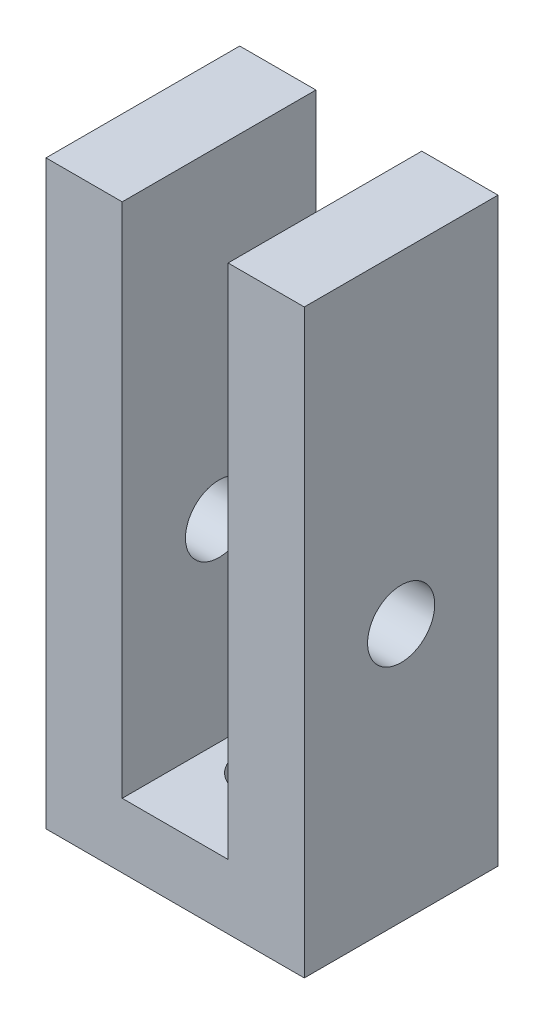
ISO-10303-21;
HEADER;
FILE_DESCRIPTION(('STEP AP214'),'2;1');
FILE_NAME('part.step','',(''),(''),'','','');
FILE_SCHEMA(('AUTOMOTIVE_DESIGN { 1 0 10303 214 1 1 1 1 }'));
ENDSEC;
DATA;
#1=APPLICATION_CONTEXT('core data for automotive mechanical design processes');
#2=APPLICATION_PROTOCOL_DEFINITION('international standard','automotive_design',2000,#1);
#3=PRODUCT_CONTEXT('',#1,'mechanical');
#4=PRODUCT('Part','Part','',(#3));
#5=PRODUCT_RELATED_PRODUCT_CATEGORY('part','',(#4));
#6=PRODUCT_DEFINITION_FORMATION('','',#4);
#7=PRODUCT_DEFINITION_CONTEXT('part definition',#1,'design');
#8=PRODUCT_DEFINITION('design','',#6,#7);
#9=PRODUCT_DEFINITION_SHAPE('','',#8);
#10=(LENGTH_UNIT() NAMED_UNIT(*) SI_UNIT(.MILLI.,.METRE.));
#11=(NAMED_UNIT(*) PLANE_ANGLE_UNIT() SI_UNIT($,.RADIAN.));
#12=(NAMED_UNIT(*) SI_UNIT($,.STERADIAN.) SOLID_ANGLE_UNIT());
#13=UNCERTAINTY_MEASURE_WITH_UNIT(LENGTH_MEASURE(1.E-05),#10,'distance_accuracy_value','');
#14=(GEOMETRIC_REPRESENTATION_CONTEXT(3) GLOBAL_UNCERTAINTY_ASSIGNED_CONTEXT((#13)) GLOBAL_UNIT_ASSIGNED_CONTEXT((#10,
#11,#12)) REPRESENTATION_CONTEXT('',''));
#15=CARTESIAN_POINT('',(0.,0.,0.));
#16=DIRECTION('',(0.,0.,1.));
#17=DIRECTION('',(1.,0.,0.));
#18=AXIS2_PLACEMENT_3D('',#15,#16,#17);
#19=CARTESIAN_POINT('',(0.,5.,-15.));
#20=DIRECTION('',(0.,-1.,0.));
#21=DIRECTION('',(0.,0.,-1.));
#22=AXIS2_PLACEMENT_3D('',#19,#20,#21);
#23=PLANE('',#22);
#24=CARTESIAN_POINT('',(10.,5.,-7.5));
#25=DIRECTION('',(0.,1.,0.));
#26=DIRECTION('',(0.,0.,1.));
#27=AXIS2_PLACEMENT_3D('',#24,#25,#26);
#28=CIRCLE('',#27,2.59999999999996);
#29=CARTESIAN_POINT('',(10.,5.,-4.90000000000004));
#30=VERTEX_POINT('',#29);
#31=EDGE_CURVE('E150',#30,#30,#28,.T.);
#32=ORIENTED_EDGE('',*,*,#31,.F.);
#33=EDGE_LOOP('',(#32));
#34=FACE_BOUND('',#33,.T.);
#35=DIRECTION('',(0.,0.,1.));
#36=VECTOR('',#35,1.);
#37=CARTESIAN_POINT('',(14.1,5.,-15.));
#38=LINE('',#37,#36);
#39=CARTESIAN_POINT('',(14.1,5.,-15.));
#40=VERTEX_POINT('',#39);
#41=CARTESIAN_POINT('',(14.1,5.,0.));
#42=VERTEX_POINT('',#41);
#43=EDGE_CURVE('E124',#40,#42,#38,.T.);
#44=ORIENTED_EDGE('',*,*,#43,.F.);
#45=DIRECTION('',(-1.,0.,0.));
#46=VECTOR('',#45,1.);
#47=CARTESIAN_POINT('',(0.,5.,-15.));
#48=LINE('',#47,#46);
#49=CARTESIAN_POINT('',(5.9,5.,-15.));
#50=VERTEX_POINT('',#49);
#51=EDGE_CURVE('E165',#40,#50,#48,.T.);
#52=ORIENTED_EDGE('',*,*,#51,.T.);
#53=DIRECTION('',(0.,0.,-1.));
#54=VECTOR('',#53,1.);
#55=CARTESIAN_POINT('',(5.9,5.,-15.));
#56=LINE('',#55,#54);
#57=CARTESIAN_POINT('',(5.9,5.,0.));
#58=VERTEX_POINT('',#57);
#59=EDGE_CURVE('E55',#58,#50,#56,.T.);
#60=ORIENTED_EDGE('',*,*,#59,.F.);
#61=DIRECTION('',(1.,0.,0.));
#62=VECTOR('',#61,1.);
#63=CARTESIAN_POINT('',(0.,5.,0.));
#64=LINE('',#63,#62);
#65=EDGE_CURVE('E50',#58,#42,#64,.T.);
#66=ORIENTED_EDGE('',*,*,#65,.T.);
#67=EDGE_LOOP('',(#44,#52,#60,#66));
#68=FACE_BOUND('',#67,.T.);
#69=ADVANCED_FACE('F33',(#34,#68),#23,.F.);
#70=CARTESIAN_POINT('',(0.,5.,0.));
#71=DIRECTION('',(1.,0.,0.));
#72=DIRECTION('',(0.,0.,-1.));
#73=AXIS2_PLACEMENT_3D('',#70,#71,#72);
#74=PLANE('',#73);
#75=CARTESIAN_POINT('',(0.,20.,-7.5));
#76=DIRECTION('',(-1.,0.,0.));
#77=DIRECTION('',(0.,0.,1.));
#78=AXIS2_PLACEMENT_3D('',#75,#76,#77);
#79=CIRCLE('',#78,2.6);
#80=CARTESIAN_POINT('',(0.,20.,-4.9));
#81=VERTEX_POINT('',#80);
#82=EDGE_CURVE('E334',#81,#81,#79,.T.);
#83=ORIENTED_EDGE('',*,*,#82,.F.);
#84=EDGE_LOOP('',(#83));
#85=FACE_BOUND('',#84,.T.);
#86=DIRECTION('',(0.,0.,1.));
#87=VECTOR('',#86,1.);
#88=CARTESIAN_POINT('',(0.,0.,0.));
#89=LINE('',#88,#87);
#90=CARTESIAN_POINT('',(0.,0.,-15.));
#91=VERTEX_POINT('',#90);
#92=CARTESIAN_POINT('',(0.,0.,0.));
#93=VERTEX_POINT('',#92);
#94=EDGE_CURVE('E170',#91,#93,#89,.T.);
#95=ORIENTED_EDGE('',*,*,#94,.T.);
#96=DIRECTION('',(0.,-1.,0.));
#97=VECTOR('',#96,1.);
#98=CARTESIAN_POINT('',(0.,5.,0.));
#99=LINE('',#98,#97);
#100=CARTESIAN_POINT('',(0.,45.,0.));
#101=VERTEX_POINT('',#100);
#102=EDGE_CURVE('E11',#101,#93,#99,.T.);
#103=ORIENTED_EDGE('',*,*,#102,.F.);
#104=DIRECTION('',(0.,0.,1.));
#105=VECTOR('',#104,1.);
#106=CARTESIAN_POINT('',(0.,45.,-15.));
#107=LINE('',#106,#105);
#108=CARTESIAN_POINT('',(0.,45.,-15.));
#109=VERTEX_POINT('',#108);
#110=EDGE_CURVE('E137',#109,#101,#107,.T.);
#111=ORIENTED_EDGE('',*,*,#110,.F.);
#112=DIRECTION('',(0.,-1.,0.));
#113=VECTOR('',#112,1.);
#114=CARTESIAN_POINT('',(0.,5.,-15.));
#115=LINE('',#114,#113);
#116=EDGE_CURVE('E109',#109,#91,#115,.T.);
#117=ORIENTED_EDGE('',*,*,#116,.T.);
#118=EDGE_LOOP('',(#95,#103,#111,#117));
#119=FACE_BOUND('',#118,.T.);
#120=ADVANCED_FACE('F35',(#85,#119),#74,.F.);
#121=CARTESIAN_POINT('',(0.,5.,0.));
#122=DIRECTION('',(0.,0.,-1.));
#123=DIRECTION('',(-1.,0.,0.));
#124=AXIS2_PLACEMENT_3D('',#121,#122,#123);
#125=PLANE('',#124);
#126=DIRECTION('',(1.,0.,0.));
#127=VECTOR('',#126,1.);
#128=CARTESIAN_POINT('',(0.,0.,0.));
#129=LINE('',#128,#127);
#130=CARTESIAN_POINT('',(20.,0.,0.));
#131=VERTEX_POINT('',#130);
#132=EDGE_CURVE('E173',#93,#131,#129,.T.);
#133=ORIENTED_EDGE('',*,*,#132,.T.);
#134=DIRECTION('',(0.,-1.,0.));
#135=VECTOR('',#134,1.);
#136=CARTESIAN_POINT('',(20.,5.,0.));
#137=LINE('',#136,#135);
#138=CARTESIAN_POINT('',(20.,45.,0.));
#139=VERTEX_POINT('',#138);
#140=EDGE_CURVE('E42',#139,#131,#137,.T.);
#141=ORIENTED_EDGE('',*,*,#140,.F.);
#142=DIRECTION('',(1.,0.,0.));
#143=VECTOR('',#142,1.);
#144=CARTESIAN_POINT('',(20.,45.,0.));
#145=LINE('',#144,#143);
#146=CARTESIAN_POINT('',(14.1,45.,0.));
#147=VERTEX_POINT('',#146);
#148=EDGE_CURVE('E123',#147,#139,#145,.T.);
#149=ORIENTED_EDGE('',*,*,#148,.F.);
#150=DIRECTION('',(0.,-1.,0.));
#151=VECTOR('',#150,1.);
#152=CARTESIAN_POINT('',(14.1,45.,0.));
#153=LINE('',#152,#151);
#154=EDGE_CURVE('E132',#147,#42,#153,.T.);
#155=ORIENTED_EDGE('',*,*,#154,.T.);
#156=ORIENTED_EDGE('',*,*,#65,.F.);
#157=DIRECTION('',(0.,-1.,0.));
#158=VECTOR('',#157,1.);
#159=CARTESIAN_POINT('',(5.9,45.,0.));
#160=LINE('',#159,#158);
#161=CARTESIAN_POINT('',(5.9,45.,0.));
#162=VERTEX_POINT('',#161);
#163=EDGE_CURVE('E158',#162,#58,#160,.T.);
#164=ORIENTED_EDGE('',*,*,#163,.F.);
#165=DIRECTION('',(1.,0.,0.));
#166=VECTOR('',#165,1.);
#167=CARTESIAN_POINT('',(0.,45.,0.));
#168=LINE('',#167,#166);
#169=EDGE_CURVE('E140',#101,#162,#168,.T.);
#170=ORIENTED_EDGE('',*,*,#169,.F.);
#171=ORIENTED_EDGE('',*,*,#102,.T.);
#172=EDGE_LOOP('',(#133,#141,#149,#155,#156,#164,#170,#171));
#173=FACE_BOUND('',#172,.T.);
#174=ADVANCED_FACE('F195',(#173),#125,.F.);
#175=CARTESIAN_POINT('',(20.,5.,0.));
#176=DIRECTION('',(-1.,0.,0.));
#177=DIRECTION('',(0.,0.,1.));
#178=AXIS2_PLACEMENT_3D('',#175,#176,#177);
#179=PLANE('',#178);
#180=CARTESIAN_POINT('',(20.,20.,-7.5));
#181=DIRECTION('',(-1.,0.,0.));
#182=DIRECTION('',(0.,0.,1.));
#183=AXIS2_PLACEMENT_3D('',#180,#181,#182);
#184=CIRCLE('',#183,2.6);
#185=CARTESIAN_POINT('',(20.,20.,-4.9));
#186=VERTEX_POINT('',#185);
#187=EDGE_CURVE('E338',#186,#186,#184,.T.);
#188=ORIENTED_EDGE('',*,*,#187,.T.);
#189=EDGE_LOOP('',(#188));
#190=FACE_BOUND('',#189,.T.);
#191=DIRECTION('',(0.,0.,-1.));
#192=VECTOR('',#191,1.);
#193=CARTESIAN_POINT('',(20.,0.,0.));
#194=LINE('',#193,#192);
#195=CARTESIAN_POINT('',(20.,0.,-15.));
#196=VERTEX_POINT('',#195);
#197=EDGE_CURVE('E106',#131,#196,#194,.T.);
#198=ORIENTED_EDGE('',*,*,#197,.T.);
#199=DIRECTION('',(0.,-1.,0.));
#200=VECTOR('',#199,1.);
#201=CARTESIAN_POINT('',(20.,5.,-15.));
#202=LINE('',#201,#200);
#203=CARTESIAN_POINT('',(20.,45.,-15.));
#204=VERTEX_POINT('',#203);
#205=EDGE_CURVE('E99',#204,#196,#202,.T.);
#206=ORIENTED_EDGE('',*,*,#205,.F.);
#207=DIRECTION('',(0.,0.,-1.));
#208=VECTOR('',#207,1.);
#209=CARTESIAN_POINT('',(20.,45.,-15.));
#210=LINE('',#209,#208);
#211=EDGE_CURVE('E104',#139,#204,#210,.T.);
#212=ORIENTED_EDGE('',*,*,#211,.F.);
#213=ORIENTED_EDGE('',*,*,#140,.T.);
#214=EDGE_LOOP('',(#198,#206,#212,#213));
#215=FACE_BOUND('',#214,.T.);
#216=ADVANCED_FACE('F101',(#190,#215),#179,.F.);
#217=CARTESIAN_POINT('',(0.,5.,-15.));
#218=DIRECTION('',(0.,0.,1.));
#219=DIRECTION('',(1.,0.,0.));
#220=AXIS2_PLACEMENT_3D('',#217,#218,#219);
#221=PLANE('',#220);
#222=DIRECTION('',(-1.,0.,0.));
#223=VECTOR('',#222,1.);
#224=CARTESIAN_POINT('',(0.,0.,-15.));
#225=LINE('',#224,#223);
#226=EDGE_CURVE('E176',#196,#91,#225,.T.);
#227=ORIENTED_EDGE('',*,*,#226,.T.);
#228=ORIENTED_EDGE('',*,*,#116,.F.);
#229=DIRECTION('',(-1.,0.,0.));
#230=VECTOR('',#229,1.);
#231=CARTESIAN_POINT('',(0.,45.,-15.));
#232=LINE('',#231,#230);
#233=CARTESIAN_POINT('',(5.9,45.,-15.));
#234=VERTEX_POINT('',#233);
#235=EDGE_CURVE('E144',#234,#109,#232,.T.);
#236=ORIENTED_EDGE('',*,*,#235,.F.);
#237=DIRECTION('',(0.,-1.,0.));
#238=VECTOR('',#237,1.);
#239=CARTESIAN_POINT('',(5.9,45.,-15.));
#240=LINE('',#239,#238);
#241=EDGE_CURVE('E147',#234,#50,#240,.T.);
#242=ORIENTED_EDGE('',*,*,#241,.T.);
#243=ORIENTED_EDGE('',*,*,#51,.F.);
#244=DIRECTION('',(0.,-1.,0.));
#245=VECTOR('',#244,1.);
#246=CARTESIAN_POINT('',(14.1,45.,-15.));
#247=LINE('',#246,#245);
#248=CARTESIAN_POINT('',(14.1,45.,-15.));
#249=VERTEX_POINT('',#248);
#250=EDGE_CURVE('E115',#249,#40,#247,.T.);
#251=ORIENTED_EDGE('',*,*,#250,.F.);
#252=DIRECTION('',(-1.,0.,0.));
#253=VECTOR('',#252,1.);
#254=CARTESIAN_POINT('',(20.,45.,-15.));
#255=LINE('',#254,#253);
#256=EDGE_CURVE('E112',#204,#249,#255,.T.);
#257=ORIENTED_EDGE('',*,*,#256,.F.);
#258=ORIENTED_EDGE('',*,*,#205,.T.);
#259=EDGE_LOOP('',(#227,#228,#236,#242,#243,#251,#257,#258));
#260=FACE_BOUND('',#259,.T.);
#261=ADVANCED_FACE('F113',(#260),#221,.F.);
#262=CARTESIAN_POINT('',(0.,0.,-15.));
#263=DIRECTION('',(0.,-1.,0.));
#264=DIRECTION('',(0.,0.,-1.));
#265=AXIS2_PLACEMENT_3D('',#262,#263,#264);
#266=PLANE('',#265);
#267=CARTESIAN_POINT('',(10.,0.,-7.5));
#268=DIRECTION('',(0.,-1.,0.));
#269=DIRECTION('',(0.,0.,-1.));
#270=AXIS2_PLACEMENT_3D('',#267,#268,#269);
#271=CIRCLE('',#270,2.59999999999996);
#272=CARTESIAN_POINT('',(10.,0.,-10.1));
#273=VERTEX_POINT('',#272);
#274=EDGE_CURVE('E163',#273,#273,#271,.F.);
#275=ORIENTED_EDGE('',*,*,#274,.T.);
#276=EDGE_LOOP('',(#275));
#277=FACE_BOUND('',#276,.T.);
#278=ORIENTED_EDGE('',*,*,#94,.F.);
#279=ORIENTED_EDGE('',*,*,#226,.F.);
#280=ORIENTED_EDGE('',*,*,#197,.F.);
#281=ORIENTED_EDGE('',*,*,#132,.F.);
#282=EDGE_LOOP('',(#278,#279,#280,#281));
#283=FACE_BOUND('',#282,.T.);
#284=ADVANCED_FACE('F183',(#277,#283),#266,.T.);
#285=CARTESIAN_POINT('',(10.,-0.00100000000000013,-7.5));
#286=DIRECTION('',(0.,1.,0.));
#287=DIRECTION('',(0.,0.,1.));
#288=AXIS2_PLACEMENT_3D('',#285,#286,#287);
#289=CYLINDRICAL_SURFACE('',#288,2.59999999999996);
#290=ORIENTED_EDGE('',*,*,#274,.F.);
#291=EDGE_LOOP('',(#290));
#292=FACE_BOUND('',#291,.T.);
#293=ORIENTED_EDGE('',*,*,#31,.T.);
#294=EDGE_LOOP('',(#293));
#295=FACE_BOUND('',#294,.T.);
#296=ADVANCED_FACE('F209',(#292,#295),#289,.F.);
#297=CARTESIAN_POINT('',(5.9,45.,-15.));
#298=DIRECTION('',(-1.,0.,0.));
#299=DIRECTION('',(0.,0.,1.));
#300=AXIS2_PLACEMENT_3D('',#297,#298,#299);
#301=PLANE('',#300);
#302=CARTESIAN_POINT('',(5.9,20.,-7.5));
#303=DIRECTION('',(-1.,0.,0.));
#304=DIRECTION('',(0.,0.,1.));
#305=AXIS2_PLACEMENT_3D('',#302,#303,#304);
#306=CIRCLE('',#305,2.6);
#307=CARTESIAN_POINT('',(5.9,20.,-4.9));
#308=VERTEX_POINT('',#307);
#309=EDGE_CURVE('E126',#308,#308,#306,.T.);
#310=ORIENTED_EDGE('',*,*,#309,.T.);
#311=EDGE_LOOP('',(#310));
#312=FACE_BOUND('',#311,.T.);
#313=ORIENTED_EDGE('',*,*,#59,.T.);
#314=ORIENTED_EDGE('',*,*,#241,.F.);
#315=DIRECTION('',(0.,0.,-1.));
#316=VECTOR('',#315,1.);
#317=CARTESIAN_POINT('',(5.9,45.,-15.));
#318=LINE('',#317,#316);
#319=EDGE_CURVE('E142',#162,#234,#318,.T.);
#320=ORIENTED_EDGE('',*,*,#319,.F.);
#321=ORIENTED_EDGE('',*,*,#163,.T.);
#322=EDGE_LOOP('',(#313,#314,#320,#321));
#323=FACE_BOUND('',#322,.T.);
#324=ADVANCED_FACE('F194',(#312,#323),#301,.F.);
#325=CARTESIAN_POINT('',(0.,45.,0.));
#326=DIRECTION('',(0.,1.,0.));
#327=DIRECTION('',(0.,0.,1.));
#328=AXIS2_PLACEMENT_3D('',#325,#326,#327);
#329=PLANE('',#328);
#330=ORIENTED_EDGE('',*,*,#110,.T.);
#331=ORIENTED_EDGE('',*,*,#169,.T.);
#332=ORIENTED_EDGE('',*,*,#319,.T.);
#333=ORIENTED_EDGE('',*,*,#235,.T.);
#334=EDGE_LOOP('',(#330,#331,#332,#333));
#335=FACE_BOUND('',#334,.T.);
#336=ADVANCED_FACE('F189',(#335),#329,.T.);
#337=CARTESIAN_POINT('',(14.1,45.,-15.));
#338=DIRECTION('',(1.,0.,0.));
#339=DIRECTION('',(0.,0.,-1.));
#340=AXIS2_PLACEMENT_3D('',#337,#338,#339);
#341=PLANE('',#340);
#342=CARTESIAN_POINT('',(14.1,20.,-7.5));
#343=DIRECTION('',(1.,0.,0.));
#344=DIRECTION('',(0.,0.,-1.));
#345=AXIS2_PLACEMENT_3D('',#342,#343,#344);
#346=CIRCLE('',#345,2.6);
#347=CARTESIAN_POINT('',(14.1,20.,-10.1));
#348=VERTEX_POINT('',#347);
#349=EDGE_CURVE('E37',#348,#348,#346,.T.);
#350=ORIENTED_EDGE('',*,*,#349,.T.);
#351=EDGE_LOOP('',(#350));
#352=FACE_BOUND('',#351,.T.);
#353=ORIENTED_EDGE('',*,*,#43,.T.);
#354=ORIENTED_EDGE('',*,*,#154,.F.);
#355=DIRECTION('',(0.,0.,1.));
#356=VECTOR('',#355,1.);
#357=CARTESIAN_POINT('',(14.1,45.,-15.));
#358=LINE('',#357,#356);
#359=EDGE_CURVE('E118',#249,#147,#358,.T.);
#360=ORIENTED_EDGE('',*,*,#359,.F.);
#361=ORIENTED_EDGE('',*,*,#250,.T.);
#362=EDGE_LOOP('',(#353,#354,#360,#361));
#363=FACE_BOUND('',#362,.T.);
#364=ADVANCED_FACE('F198',(#352,#363),#341,.F.);
#365=CARTESIAN_POINT('',(20.,45.,0.));
#366=DIRECTION('',(0.,-1.,0.));
#367=DIRECTION('',(0.,0.,-1.));
#368=AXIS2_PLACEMENT_3D('',#365,#366,#367);
#369=PLANE('',#368);
#370=ORIENTED_EDGE('',*,*,#211,.T.);
#371=ORIENTED_EDGE('',*,*,#256,.T.);
#372=ORIENTED_EDGE('',*,*,#359,.T.);
#373=ORIENTED_EDGE('',*,*,#148,.T.);
#374=EDGE_LOOP('',(#370,#371,#372,#373));
#375=FACE_BOUND('',#374,.T.);
#376=ADVANCED_FACE('F121',(#375),#369,.F.);
#377=CARTESIAN_POINT('',(20.,20.,-7.5));
#378=DIRECTION('',(-1.,0.,0.));
#379=DIRECTION('',(0.,0.,1.));
#380=AXIS2_PLACEMENT_3D('',#377,#378,#379);
#381=CYLINDRICAL_SURFACE('',#380,2.6);
#382=ORIENTED_EDGE('',*,*,#187,.F.);
#383=EDGE_LOOP('',(#382));
#384=FACE_BOUND('',#383,.T.);
#385=ORIENTED_EDGE('',*,*,#349,.F.);
#386=EDGE_LOOP('',(#385));
#387=FACE_BOUND('',#386,.T.);
#388=ADVANCED_FACE('F267',(#384,#387),#381,.F.);
#389=ORIENTED_EDGE('',*,*,#82,.T.);
#390=EDGE_LOOP('',(#389));
#391=FACE_BOUND('',#390,.T.);
#392=ORIENTED_EDGE('',*,*,#309,.F.);
#393=EDGE_LOOP('',(#392));
#394=FACE_BOUND('',#393,.T.);
#395=ADVANCED_FACE('F273',(#391,#394),#381,.F.);
#396=CLOSED_SHELL('',(#69,#120,#174,#216,#261,#284,#296,#324,#336,#364,#376,#388,#395));
#397=MANIFOLD_SOLID_BREP('B2',#396);
#398=ADVANCED_BREP_SHAPE_REPRESENTATION('',(#18,#397),#14);
#399=SHAPE_DEFINITION_REPRESENTATION(#9,#398);
ENDSEC;
END-ISO-10303-21;
